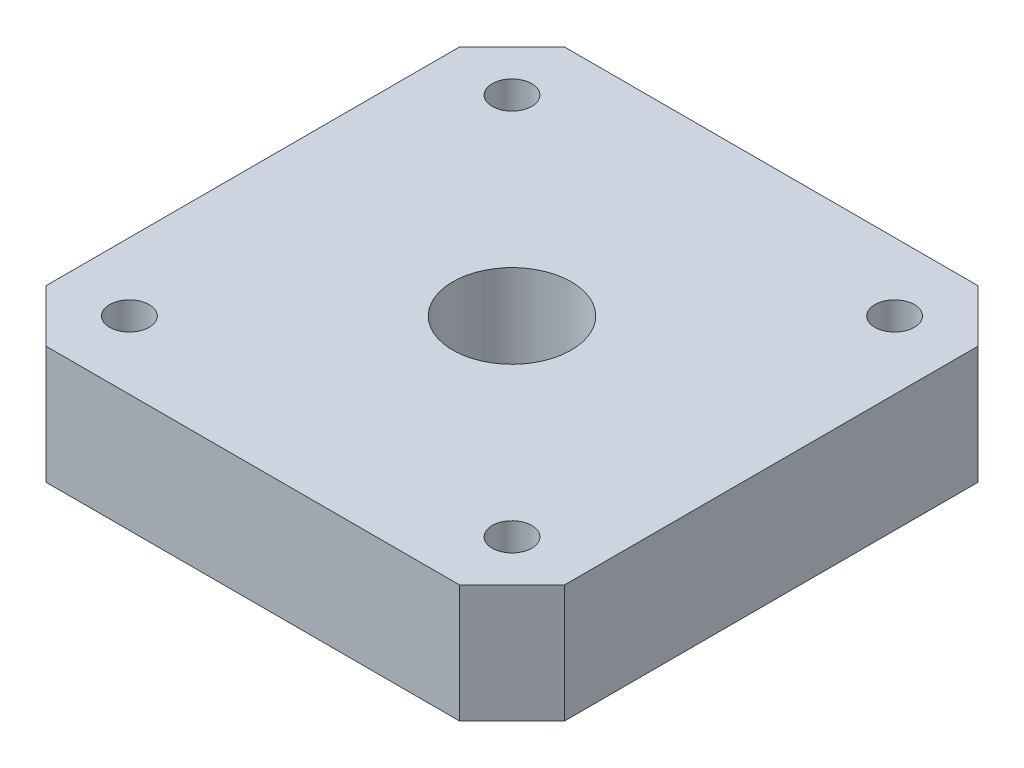
ISO-10303-21;
HEADER;
FILE_DESCRIPTION(('STEP AP214'),'2;1');
FILE_NAME('part.step','',(''),(''),'','','');
FILE_SCHEMA(('AUTOMOTIVE_DESIGN { 1 0 10303 214 1 1 1 1 }'));
ENDSEC;
DATA;
#1=APPLICATION_CONTEXT('core data for automotive mechanical design processes');
#2=APPLICATION_PROTOCOL_DEFINITION('international standard','automotive_design',2000,#1);
#3=PRODUCT_CONTEXT('',#1,'mechanical');
#4=PRODUCT('Part','Part','',(#3));
#5=PRODUCT_RELATED_PRODUCT_CATEGORY('part','',(#4));
#6=PRODUCT_DEFINITION_FORMATION('','',#4);
#7=PRODUCT_DEFINITION_CONTEXT('part definition',#1,'design');
#8=PRODUCT_DEFINITION('design','',#6,#7);
#9=PRODUCT_DEFINITION_SHAPE('','',#8);
#10=(LENGTH_UNIT() NAMED_UNIT(*) SI_UNIT(.MILLI.,.METRE.));
#11=(NAMED_UNIT(*) PLANE_ANGLE_UNIT() SI_UNIT($,.RADIAN.));
#12=(NAMED_UNIT(*) SI_UNIT($,.STERADIAN.) SOLID_ANGLE_UNIT());
#13=UNCERTAINTY_MEASURE_WITH_UNIT(LENGTH_MEASURE(1.E-05),#10,'distance_accuracy_value','');
#14=(GEOMETRIC_REPRESENTATION_CONTEXT(3) GLOBAL_UNCERTAINTY_ASSIGNED_CONTEXT((#13)) GLOBAL_UNIT_ASSIGNED_CONTEXT((#10,
#11,#12)) REPRESENTATION_CONTEXT('',''));
#15=CARTESIAN_POINT('',(0.,0.,0.));
#16=DIRECTION('',(0.,0.,1.));
#17=DIRECTION('',(1.,0.,0.));
#18=AXIS2_PLACEMENT_3D('',#15,#16,#17);
#19=CARTESIAN_POINT('',(21.,-9.55,21.));
#20=DIRECTION('',(1.,0.,0.));
#21=DIRECTION('',(0.,0.,-1.));
#22=AXIS2_PLACEMENT_3D('',#19,#20,#21);
#23=PLANE('',#22);
#24=DIRECTION('',(0.,-1.,0.));
#25=VECTOR('',#24,1.);
#26=CARTESIAN_POINT('',(20.9999999999963,0.,16.7573593128807));
#27=LINE('',#26,#25);
#28=CARTESIAN_POINT('',(21.,0.,16.7573593128807));
#29=VERTEX_POINT('',#28);
#30=CARTESIAN_POINT('',(20.9999999999963,-9.55,16.7573593128807));
#31=VERTEX_POINT('',#30);
#32=EDGE_CURVE('E163',#29,#31,#27,.T.);
#33=ORIENTED_EDGE('',*,*,#32,.T.);
#34=DIRECTION('',(0.,0.,-1.));
#35=VECTOR('',#34,1.);
#36=CARTESIAN_POINT('',(21.,-9.55,21.));
#37=LINE('',#36,#35);
#38=CARTESIAN_POINT('',(20.9999999999963,-9.55,-16.7573593128807));
#39=VERTEX_POINT('',#38);
#40=EDGE_CURVE('E135',#31,#39,#37,.T.);
#41=ORIENTED_EDGE('',*,*,#40,.T.);
#42=DIRECTION('',(0.,-1.,0.));
#43=VECTOR('',#42,1.);
#44=CARTESIAN_POINT('',(20.9999999999963,0.,-16.7573593128807));
#45=LINE('',#44,#43);
#46=CARTESIAN_POINT('',(20.9999999999963,0.,-16.7573593128807));
#47=VERTEX_POINT('',#46);
#48=EDGE_CURVE('E171',#47,#39,#45,.T.);
#49=ORIENTED_EDGE('',*,*,#48,.F.);
#50=DIRECTION('',(0.,0.,-1.));
#51=VECTOR('',#50,1.);
#52=CARTESIAN_POINT('',(21.,0.,21.));
#53=LINE('',#52,#51);
#54=EDGE_CURVE('E136',#29,#47,#53,.T.);
#55=ORIENTED_EDGE('',*,*,#54,.F.);
#56=EDGE_LOOP('',(#33,#41,#49,#55));
#57=FACE_BOUND('',#56,.T.);
#58=ADVANCED_FACE('F43',(#57),#23,.T.);
#59=CARTESIAN_POINT('',(-21.,-9.55,21.));
#60=DIRECTION('',(0.,0.,1.));
#61=DIRECTION('',(1.,0.,0.));
#62=AXIS2_PLACEMENT_3D('',#59,#60,#61);
#63=PLANE('',#62);
#64=DIRECTION('',(0.,-1.,0.));
#65=VECTOR('',#64,1.);
#66=CARTESIAN_POINT('',(16.757359312877,0.,21.));
#67=LINE('',#66,#65);
#68=CARTESIAN_POINT('',(16.757359312877,0.,21.));
#69=VERTEX_POINT('',#68);
#70=CARTESIAN_POINT('',(16.757359312877,-9.55,21.));
#71=VERTEX_POINT('',#70);
#72=EDGE_CURVE('E165',#69,#71,#67,.T.);
#73=ORIENTED_EDGE('',*,*,#72,.F.);
#74=DIRECTION('',(1.,0.,0.));
#75=VECTOR('',#74,1.);
#76=CARTESIAN_POINT('',(-21.,0.,21.));
#77=LINE('',#76,#75);
#78=CARTESIAN_POINT('',(-16.7573593128844,0.,21.));
#79=VERTEX_POINT('',#78);
#80=EDGE_CURVE('E46',#79,#69,#77,.T.);
#81=ORIENTED_EDGE('',*,*,#80,.F.);
#82=DIRECTION('',(0.,-1.,0.));
#83=VECTOR('',#82,1.);
#84=CARTESIAN_POINT('',(-16.7573593128845,0.,21.));
#85=LINE('',#84,#83);
#86=CARTESIAN_POINT('',(-16.7573593128845,-9.55,21.));
#87=VERTEX_POINT('',#86);
#88=EDGE_CURVE('E56',#79,#87,#85,.T.);
#89=ORIENTED_EDGE('',*,*,#88,.T.);
#90=DIRECTION('',(1.,0.,0.));
#91=VECTOR('',#90,1.);
#92=CARTESIAN_POINT('',(-21.,-9.55,21.));
#93=LINE('',#92,#91);
#94=EDGE_CURVE('E11',#87,#71,#93,.T.);
#95=ORIENTED_EDGE('',*,*,#94,.T.);
#96=EDGE_LOOP('',(#73,#81,#89,#95));
#97=FACE_BOUND('',#96,.T.);
#98=ADVANCED_FACE('F277',(#97),#63,.T.);
#99=CARTESIAN_POINT('',(-21.,-9.55,21.));
#100=DIRECTION('',(-1.,0.,0.));
#101=DIRECTION('',(0.,0.,1.));
#102=AXIS2_PLACEMENT_3D('',#99,#100,#101);
#103=PLANE('',#102);
#104=DIRECTION('',(0.,-1.,0.));
#105=VECTOR('',#104,1.);
#106=CARTESIAN_POINT('',(-21.0000000000037,0.,-16.7573593128807));
#107=LINE('',#106,#105);
#108=CARTESIAN_POINT('',(-21.,0.,-16.7573593128844));
#109=VERTEX_POINT('',#108);
#110=CARTESIAN_POINT('',(-21.0000000000037,-9.55,-16.7573593128807));
#111=VERTEX_POINT('',#110);
#112=EDGE_CURVE('E66',#109,#111,#107,.T.);
#113=ORIENTED_EDGE('',*,*,#112,.T.);
#114=DIRECTION('',(0.,0.,1.));
#115=VECTOR('',#114,1.);
#116=CARTESIAN_POINT('',(-21.,-9.55,21.));
#117=LINE('',#116,#115);
#118=CARTESIAN_POINT('',(-21.0000000000037,-9.55,16.7573593128807));
#119=VERTEX_POINT('',#118);
#120=EDGE_CURVE('E51',#111,#119,#117,.T.);
#121=ORIENTED_EDGE('',*,*,#120,.T.);
#122=DIRECTION('',(0.,-1.,0.));
#123=VECTOR('',#122,1.);
#124=CARTESIAN_POINT('',(-21.0000000000037,0.,16.7573593128807));
#125=LINE('',#124,#123);
#126=CARTESIAN_POINT('',(-21.0000000000037,0.,16.7573593128807));
#127=VERTEX_POINT('',#126);
#128=EDGE_CURVE('E151',#127,#119,#125,.T.);
#129=ORIENTED_EDGE('',*,*,#128,.F.);
#130=DIRECTION('',(0.,0.,1.));
#131=VECTOR('',#130,1.);
#132=CARTESIAN_POINT('',(-21.,0.,21.));
#133=LINE('',#132,#131);
#134=EDGE_CURVE('E121',#109,#127,#133,.T.);
#135=ORIENTED_EDGE('',*,*,#134,.F.);
#136=EDGE_LOOP('',(#113,#121,#129,#135));
#137=FACE_BOUND('',#136,.T.);
#138=ADVANCED_FACE('F122',(#137),#103,.T.);
#139=CARTESIAN_POINT('',(-21.,-9.55,-21.));
#140=DIRECTION('',(0.,0.,-1.));
#141=DIRECTION('',(-1.,0.,0.));
#142=AXIS2_PLACEMENT_3D('',#139,#140,#141);
#143=PLANE('',#142);
#144=DIRECTION('',(0.,-1.,0.));
#145=VECTOR('',#144,1.);
#146=CARTESIAN_POINT('',(16.757359312877,0.,-21.));
#147=LINE('',#146,#145);
#148=CARTESIAN_POINT('',(16.757359312877,0.,-21.));
#149=VERTEX_POINT('',#148);
#150=CARTESIAN_POINT('',(16.757359312877,-9.55,-21.));
#151=VERTEX_POINT('',#150);
#152=EDGE_CURVE('E161',#149,#151,#147,.T.);
#153=ORIENTED_EDGE('',*,*,#152,.T.);
#154=DIRECTION('',(-1.,0.,0.));
#155=VECTOR('',#154,1.);
#156=CARTESIAN_POINT('',(-21.,-9.55,-21.));
#157=LINE('',#156,#155);
#158=CARTESIAN_POINT('',(-16.7573593128845,-9.55,-21.));
#159=VERTEX_POINT('',#158);
#160=EDGE_CURVE('E134',#151,#159,#157,.T.);
#161=ORIENTED_EDGE('',*,*,#160,.T.);
#162=DIRECTION('',(0.,-1.,0.));
#163=VECTOR('',#162,1.);
#164=CARTESIAN_POINT('',(-16.7573593128845,0.,-21.));
#165=LINE('',#164,#163);
#166=CARTESIAN_POINT('',(-16.7573593128845,0.,-21.));
#167=VERTEX_POINT('',#166);
#168=EDGE_CURVE('E109',#167,#159,#165,.T.);
#169=ORIENTED_EDGE('',*,*,#168,.F.);
#170=DIRECTION('',(-1.,0.,0.));
#171=VECTOR('',#170,1.);
#172=CARTESIAN_POINT('',(-21.,0.,-21.));
#173=LINE('',#172,#171);
#174=EDGE_CURVE('E137',#149,#167,#173,.T.);
#175=ORIENTED_EDGE('',*,*,#174,.F.);
#176=EDGE_LOOP('',(#153,#161,#169,#175));
#177=FACE_BOUND('',#176,.T.);
#178=ADVANCED_FACE('F252',(#177),#143,.T.);
#179=CARTESIAN_POINT('',(0.,-9.55,0.));
#180=DIRECTION('',(0.,-1.,0.));
#181=DIRECTION('',(0.,0.,-1.));
#182=AXIS2_PLACEMENT_3D('',#179,#180,#181);
#183=PLANE('',#182);
#184=CARTESIAN_POINT('',(15.4999999999963,-9.55,-15.4999999999999));
#185=DIRECTION('',(0.,-1.,0.));
#186=DIRECTION('',(0.,0.,-1.));
#187=AXIS2_PLACEMENT_3D('',#184,#185,#186);
#188=CIRCLE('',#187,2.00000000000352);
#189=CARTESIAN_POINT('',(15.4999999999963,-9.55,-17.5000000000035));
#190=VERTEX_POINT('',#189);
#191=EDGE_CURVE('E194',#190,#190,#188,.T.);
#192=ORIENTED_EDGE('',*,*,#191,.F.);
#193=EDGE_LOOP('',(#192));
#194=FACE_BOUND('',#193,.T.);
#195=CARTESIAN_POINT('',(15.4999999999963,-9.55,15.5000000000001));
#196=DIRECTION('',(0.,-1.,0.));
#197=DIRECTION('',(0.,0.,-1.));
#198=AXIS2_PLACEMENT_3D('',#195,#196,#197);
#199=CIRCLE('',#198,2.00000000000352);
#200=CARTESIAN_POINT('',(15.4999999999963,-9.55,13.4999999999965));
#201=VERTEX_POINT('',#200);
#202=EDGE_CURVE('E197',#201,#201,#199,.T.);
#203=ORIENTED_EDGE('',*,*,#202,.F.);
#204=EDGE_LOOP('',(#203));
#205=FACE_BOUND('',#204,.T.);
#206=CARTESIAN_POINT('',(-15.5000000000037,-9.55,15.5000000000001));
#207=DIRECTION('',(0.,-1.,0.));
#208=DIRECTION('',(0.,0.,-1.));
#209=AXIS2_PLACEMENT_3D('',#206,#207,#208);
#210=CIRCLE('',#209,2.00000000000352);
#211=CARTESIAN_POINT('',(-15.5000000000037,-9.55,13.4999999999965));
#212=VERTEX_POINT('',#211);
#213=EDGE_CURVE('E190',#212,#212,#210,.T.);
#214=ORIENTED_EDGE('',*,*,#213,.F.);
#215=EDGE_LOOP('',(#214));
#216=FACE_BOUND('',#215,.T.);
#217=CARTESIAN_POINT('',(-15.5000000000037,-9.55,-15.4999999999999));
#218=DIRECTION('',(0.,-1.,0.));
#219=DIRECTION('',(0.,0.,-1.));
#220=AXIS2_PLACEMENT_3D('',#217,#218,#219);
#221=CIRCLE('',#220,2.00000000000352);
#222=CARTESIAN_POINT('',(-15.5000000000037,-9.55,-17.5000000000035));
#223=VERTEX_POINT('',#222);
#224=EDGE_CURVE('E183',#223,#223,#221,.T.);
#225=ORIENTED_EDGE('',*,*,#224,.F.);
#226=EDGE_LOOP('',(#225));
#227=FACE_BOUND('',#226,.T.);
#228=CARTESIAN_POINT('',(-3.74049749507499E-12,-9.55,0.));
#229=DIRECTION('',(0.,-1.,0.));
#230=DIRECTION('',(0.,0.,-1.));
#231=AXIS2_PLACEMENT_3D('',#228,#229,#230);
#232=CIRCLE('',#231,4.80000000000353);
#233=CARTESIAN_POINT('',(-3.74049749507499E-12,-9.55,-4.80000000000353));
#234=VERTEX_POINT('',#233);
#235=EDGE_CURVE('E178',#234,#234,#232,.T.);
#236=ORIENTED_EDGE('',*,*,#235,.F.);
#237=EDGE_LOOP('',(#236));
#238=FACE_BOUND('',#237,.T.);
#239=DIRECTION('',(0.707106781186547,0.,-0.707106781186547));
#240=VECTOR('',#239,1.);
#241=CARTESIAN_POINT('',(16.757359312877,-9.55,21.));
#242=LINE('',#241,#240);
#243=EDGE_CURVE('E159',#71,#31,#242,.T.);
#244=ORIENTED_EDGE('',*,*,#243,.F.);
#245=ORIENTED_EDGE('',*,*,#94,.F.);
#246=DIRECTION('',(0.707106781186547,0.,0.707106781186548));
#247=VECTOR('',#246,1.);
#248=CARTESIAN_POINT('',(-21.0000000000037,-9.55,16.7573593128807));
#249=LINE('',#248,#247);
#250=EDGE_CURVE('E114',#119,#87,#249,.T.);
#251=ORIENTED_EDGE('',*,*,#250,.F.);
#252=ORIENTED_EDGE('',*,*,#120,.F.);
#253=DIRECTION('',(-0.707106781186547,0.,0.707106781186547));
#254=VECTOR('',#253,1.);
#255=CARTESIAN_POINT('',(-21.0000000000037,-9.55,-16.7573593128807));
#256=LINE('',#255,#254);
#257=EDGE_CURVE('E110',#159,#111,#256,.T.);
#258=ORIENTED_EDGE('',*,*,#257,.F.);
#259=ORIENTED_EDGE('',*,*,#160,.F.);
#260=DIRECTION('',(-0.707106781186548,0.,-0.707106781186547));
#261=VECTOR('',#260,1.);
#262=CARTESIAN_POINT('',(20.9999999999963,-9.55,-16.7573593128807));
#263=LINE('',#262,#261);
#264=EDGE_CURVE('E123',#39,#151,#263,.T.);
#265=ORIENTED_EDGE('',*,*,#264,.F.);
#266=ORIENTED_EDGE('',*,*,#40,.F.);
#267=EDGE_LOOP('',(#244,#245,#251,#252,#258,#259,#265,#266));
#268=FACE_BOUND('',#267,.T.);
#269=ADVANCED_FACE('F126',(#194,#205,#216,#227,#238,#268),#183,.T.);
#270=CARTESIAN_POINT('',(0.,0.,0.));
#271=DIRECTION('',(0.,-1.,0.));
#272=DIRECTION('',(0.,0.,-1.));
#273=AXIS2_PLACEMENT_3D('',#270,#271,#272);
#274=PLANE('',#273);
#275=CARTESIAN_POINT('',(-15.5,0.,-15.4999999999998));
#276=DIRECTION('',(0.,-1.,0.));
#277=DIRECTION('',(0.,0.,-1.));
#278=AXIS2_PLACEMENT_3D('',#275,#276,#277);
#279=CIRCLE('',#278,1.6);
#280=CARTESIAN_POINT('',(-15.5,0.,-17.0999999999998));
#281=VERTEX_POINT('',#280);
#282=EDGE_CURVE('E221',#281,#281,#279,.T.);
#283=ORIENTED_EDGE('',*,*,#282,.T.);
#284=EDGE_LOOP('',(#283));
#285=FACE_BOUND('',#284,.T.);
#286=CARTESIAN_POINT('',(15.5,0.,15.5000000000002));
#287=DIRECTION('',(0.,-1.,0.));
#288=DIRECTION('',(0.,0.,-1.));
#289=AXIS2_PLACEMENT_3D('',#286,#287,#288);
#290=CIRCLE('',#289,1.6);
#291=CARTESIAN_POINT('',(15.5,0.,13.9000000000002));
#292=VERTEX_POINT('',#291);
#293=EDGE_CURVE('E211',#292,#292,#290,.T.);
#294=ORIENTED_EDGE('',*,*,#293,.T.);
#295=EDGE_LOOP('',(#294));
#296=FACE_BOUND('',#295,.T.);
#297=CARTESIAN_POINT('',(-15.5,0.,15.5000000000002));
#298=DIRECTION('',(0.,-1.,0.));
#299=DIRECTION('',(0.,0.,-1.));
#300=AXIS2_PLACEMENT_3D('',#297,#298,#299);
#301=CIRCLE('',#300,1.6);
#302=CARTESIAN_POINT('',(-15.5,0.,13.9000000000002));
#303=VERTEX_POINT('',#302);
#304=EDGE_CURVE('E228',#303,#303,#301,.T.);
#305=ORIENTED_EDGE('',*,*,#304,.T.);
#306=EDGE_LOOP('',(#305));
#307=FACE_BOUND('',#306,.T.);
#308=CARTESIAN_POINT('',(15.5,0.,-15.4999999999998));
#309=DIRECTION('',(0.,-1.,0.));
#310=DIRECTION('',(0.,0.,-1.));
#311=AXIS2_PLACEMENT_3D('',#308,#309,#310);
#312=CIRCLE('',#311,1.6);
#313=CARTESIAN_POINT('',(15.5,0.,-17.0999999999998));
#314=VERTEX_POINT('',#313);
#315=EDGE_CURVE('E191',#314,#314,#312,.T.);
#316=ORIENTED_EDGE('',*,*,#315,.T.);
#317=EDGE_LOOP('',(#316));
#318=FACE_BOUND('',#317,.T.);
#319=CARTESIAN_POINT('',(-3.74049749507499E-12,0.,0.));
#320=DIRECTION('',(0.,-1.,0.));
#321=DIRECTION('',(0.,0.,-1.));
#322=AXIS2_PLACEMENT_3D('',#319,#320,#321);
#323=CIRCLE('',#322,4.80000000000353);
#324=CARTESIAN_POINT('',(-3.74049749507499E-12,0.,-4.80000000000353));
#325=VERTEX_POINT('',#324);
#326=EDGE_CURVE('E168',#325,#325,#323,.T.);
#327=ORIENTED_EDGE('',*,*,#326,.T.);
#328=EDGE_LOOP('',(#327));
#329=FACE_BOUND('',#328,.T.);
#330=ORIENTED_EDGE('',*,*,#80,.T.);
#331=DIRECTION('',(0.707106781186547,0.,-0.707106781186547));
#332=VECTOR('',#331,1.);
#333=CARTESIAN_POINT('',(16.757359312877,0.,21.));
#334=LINE('',#333,#332);
#335=EDGE_CURVE('E158',#69,#29,#334,.T.);
#336=ORIENTED_EDGE('',*,*,#335,.T.);
#337=ORIENTED_EDGE('',*,*,#54,.T.);
#338=DIRECTION('',(-0.707106781186548,0.,-0.707106781186547));
#339=VECTOR('',#338,1.);
#340=CARTESIAN_POINT('',(20.9999999999963,0.,-16.7573593128807));
#341=LINE('',#340,#339);
#342=EDGE_CURVE('E166',#47,#149,#341,.T.);
#343=ORIENTED_EDGE('',*,*,#342,.T.);
#344=ORIENTED_EDGE('',*,*,#174,.T.);
#345=DIRECTION('',(-0.707106781186547,0.,0.707106781186547));
#346=VECTOR('',#345,1.);
#347=CARTESIAN_POINT('',(-21.0000000000037,0.,-16.7573593128807));
#348=LINE('',#347,#346);
#349=EDGE_CURVE('E116',#167,#109,#348,.T.);
#350=ORIENTED_EDGE('',*,*,#349,.T.);
#351=ORIENTED_EDGE('',*,*,#134,.T.);
#352=DIRECTION('',(0.707106781186547,0.,0.707106781186548));
#353=VECTOR('',#352,1.);
#354=CARTESIAN_POINT('',(-21.0000000000037,0.,16.7573593128807));
#355=LINE('',#354,#353);
#356=EDGE_CURVE('E153',#127,#79,#355,.T.);
#357=ORIENTED_EDGE('',*,*,#356,.T.);
#358=EDGE_LOOP('',(#330,#336,#337,#343,#344,#350,#351,#357));
#359=FACE_BOUND('',#358,.T.);
#360=ADVANCED_FACE('F249',(#285,#296,#307,#318,#329,#359),#274,.F.);
#361=CARTESIAN_POINT('',(-21.0000000000037,0.,16.7573593128807));
#362=DIRECTION('',(0.707106781186548,0.,-0.707106781186547));
#363=DIRECTION('',(-0.707106781186547,0.,-0.707106781186548));
#364=AXIS2_PLACEMENT_3D('',#361,#362,#363);
#365=PLANE('',#364);
#366=ORIENTED_EDGE('',*,*,#250,.T.);
#367=ORIENTED_EDGE('',*,*,#88,.F.);
#368=ORIENTED_EDGE('',*,*,#356,.F.);
#369=ORIENTED_EDGE('',*,*,#128,.T.);
#370=EDGE_LOOP('',(#366,#367,#368,#369));
#371=FACE_BOUND('',#370,.T.);
#372=ADVANCED_FACE('F287',(#371),#365,.F.);
#373=CARTESIAN_POINT('',(-21.0000000000037,0.,-16.7573593128807));
#374=DIRECTION('',(0.707106781186547,0.,0.707106781186547));
#375=DIRECTION('',(0.707106781186548,0.,-0.707106781186548));
#376=AXIS2_PLACEMENT_3D('',#373,#374,#375);
#377=PLANE('',#376);
#378=ORIENTED_EDGE('',*,*,#257,.T.);
#379=ORIENTED_EDGE('',*,*,#112,.F.);
#380=ORIENTED_EDGE('',*,*,#349,.F.);
#381=ORIENTED_EDGE('',*,*,#168,.T.);
#382=EDGE_LOOP('',(#378,#379,#380,#381));
#383=FACE_BOUND('',#382,.T.);
#384=ADVANCED_FACE('F108',(#383),#377,.F.);
#385=CARTESIAN_POINT('',(20.9999999999963,0.,-16.7573593128807));
#386=DIRECTION('',(-0.707106781186547,0.,0.707106781186548));
#387=DIRECTION('',(0.707106781186548,0.,0.707106781186547));
#388=AXIS2_PLACEMENT_3D('',#385,#386,#387);
#389=PLANE('',#388);
#390=ORIENTED_EDGE('',*,*,#264,.T.);
#391=ORIENTED_EDGE('',*,*,#152,.F.);
#392=ORIENTED_EDGE('',*,*,#342,.F.);
#393=ORIENTED_EDGE('',*,*,#48,.T.);
#394=EDGE_LOOP('',(#390,#391,#392,#393));
#395=FACE_BOUND('',#394,.T.);
#396=ADVANCED_FACE('F267',(#395),#389,.F.);
#397=CARTESIAN_POINT('',(16.757359312877,0.,21.));
#398=DIRECTION('',(-0.707106781186547,0.,-0.707106781186547));
#399=DIRECTION('',(-0.707106781186548,0.,0.707106781186548));
#400=AXIS2_PLACEMENT_3D('',#397,#398,#399);
#401=PLANE('',#400);
#402=ORIENTED_EDGE('',*,*,#243,.T.);
#403=ORIENTED_EDGE('',*,*,#32,.F.);
#404=ORIENTED_EDGE('',*,*,#335,.F.);
#405=ORIENTED_EDGE('',*,*,#72,.T.);
#406=EDGE_LOOP('',(#402,#403,#404,#405));
#407=FACE_BOUND('',#406,.T.);
#408=ADVANCED_FACE('F264',(#407),#401,.F.);
#409=CARTESIAN_POINT('',(-3.74049749507499E-12,0.,0.));
#410=DIRECTION('',(0.,-1.,0.));
#411=DIRECTION('',(0.,0.,-1.));
#412=AXIS2_PLACEMENT_3D('',#409,#410,#411);
#413=CYLINDRICAL_SURFACE('',#412,4.80000000000353);
#414=ORIENTED_EDGE('',*,*,#326,.F.);
#415=EDGE_LOOP('',(#414));
#416=FACE_BOUND('',#415,.T.);
#417=ORIENTED_EDGE('',*,*,#235,.T.);
#418=EDGE_LOOP('',(#417));
#419=FACE_BOUND('',#418,.T.);
#420=ADVANCED_FACE('F259',(#416,#419),#413,.F.);
#421=CARTESIAN_POINT('',(-15.5000000000037,-6.55,-15.4999999999999));
#422=DIRECTION('',(0.,-1.,0.));
#423=DIRECTION('',(0.,0.,-1.));
#424=AXIS2_PLACEMENT_3D('',#421,#422,#423);
#425=CYLINDRICAL_SURFACE('',#424,2.00000000000352);
#426=CARTESIAN_POINT('',(-15.5000000000037,-6.55,-15.4999999999999));
#427=DIRECTION('',(0.,-1.,0.));
#428=DIRECTION('',(0.,0.,-1.));
#429=AXIS2_PLACEMENT_3D('',#426,#427,#428);
#430=CIRCLE('',#429,2.00000000000352);
#431=CARTESIAN_POINT('',(-15.5000000000037,-6.55,-17.5000000000035));
#432=VERTEX_POINT('',#431);
#433=EDGE_CURVE('E181',#432,#432,#430,.T.);
#434=ORIENTED_EDGE('',*,*,#433,.F.);
#435=EDGE_LOOP('',(#434));
#436=FACE_BOUND('',#435,.T.);
#437=ORIENTED_EDGE('',*,*,#224,.T.);
#438=EDGE_LOOP('',(#437));
#439=FACE_BOUND('',#438,.T.);
#440=ADVANCED_FACE('F258',(#436,#439),#425,.F.);
#441=CARTESIAN_POINT('',(-15.5000000000037,-6.55,-15.4999999999999));
#442=DIRECTION('',(0.,-1.,0.));
#443=DIRECTION('',(0.,0.,-1.));
#444=AXIS2_PLACEMENT_3D('',#441,#442,#443);
#445=PLANE('',#444);
#446=CARTESIAN_POINT('',(-15.5,-6.55,-15.4999999999998));
#447=DIRECTION('',(0.,-1.,0.));
#448=DIRECTION('',(0.,0.,-1.));
#449=AXIS2_PLACEMENT_3D('',#446,#447,#448);
#450=CIRCLE('',#449,1.6);
#451=CARTESIAN_POINT('',(-15.5,-6.55,-17.0999999999998));
#452=VERTEX_POINT('',#451);
#453=EDGE_CURVE('E212',#452,#452,#450,.T.);
#454=ORIENTED_EDGE('',*,*,#453,.F.);
#455=EDGE_LOOP('',(#454));
#456=FACE_BOUND('',#455,.T.);
#457=ORIENTED_EDGE('',*,*,#433,.T.);
#458=EDGE_LOOP('',(#457));
#459=FACE_BOUND('',#458,.T.);
#460=ADVANCED_FACE('F242',(#456,#459),#445,.T.);
#461=CARTESIAN_POINT('',(-15.5000000000037,-6.55,15.5000000000001));
#462=DIRECTION('',(0.,-1.,0.));
#463=DIRECTION('',(0.,0.,-1.));
#464=AXIS2_PLACEMENT_3D('',#461,#462,#463);
#465=CYLINDRICAL_SURFACE('',#464,2.00000000000352);
#466=CARTESIAN_POINT('',(-15.5000000000037,-6.55,15.5000000000001));
#467=DIRECTION('',(0.,-1.,0.));
#468=DIRECTION('',(0.,0.,-1.));
#469=AXIS2_PLACEMENT_3D('',#466,#467,#468);
#470=CIRCLE('',#469,2.00000000000352);
#471=CARTESIAN_POINT('',(-15.5000000000037,-6.55,13.4999999999965));
#472=VERTEX_POINT('',#471);
#473=EDGE_CURVE('E205',#472,#472,#470,.T.);
#474=ORIENTED_EDGE('',*,*,#473,.F.);
#475=EDGE_LOOP('',(#474));
#476=FACE_BOUND('',#475,.T.);
#477=ORIENTED_EDGE('',*,*,#213,.T.);
#478=EDGE_LOOP('',(#477));
#479=FACE_BOUND('',#478,.T.);
#480=ADVANCED_FACE('F238',(#476,#479),#465,.F.);
#481=CARTESIAN_POINT('',(-15.5000000000037,-6.55,15.5000000000001));
#482=DIRECTION('',(0.,-1.,0.));
#483=DIRECTION('',(0.,0.,-1.));
#484=AXIS2_PLACEMENT_3D('',#481,#482,#483);
#485=PLANE('',#484);
#486=CARTESIAN_POINT('',(-15.5,-6.55,15.5000000000002));
#487=DIRECTION('',(0.,-1.,0.));
#488=DIRECTION('',(0.,0.,-1.));
#489=AXIS2_PLACEMENT_3D('',#486,#487,#488);
#490=CIRCLE('',#489,1.6);
#491=CARTESIAN_POINT('',(-15.5,-6.55,13.9000000000002));
#492=VERTEX_POINT('',#491);
#493=EDGE_CURVE('E220',#492,#492,#490,.T.);
#494=ORIENTED_EDGE('',*,*,#493,.F.);
#495=EDGE_LOOP('',(#494));
#496=FACE_BOUND('',#495,.T.);
#497=ORIENTED_EDGE('',*,*,#473,.T.);
#498=EDGE_LOOP('',(#497));
#499=FACE_BOUND('',#498,.T.);
#500=ADVANCED_FACE('F234',(#496,#499),#485,.T.);
#501=CARTESIAN_POINT('',(15.4999999999963,-6.55,15.5000000000001));
#502=DIRECTION('',(0.,-1.,0.));
#503=DIRECTION('',(0.,0.,-1.));
#504=AXIS2_PLACEMENT_3D('',#501,#502,#503);
#505=CYLINDRICAL_SURFACE('',#504,2.00000000000352);
#506=CARTESIAN_POINT('',(15.4999999999963,-6.55,15.5000000000001));
#507=DIRECTION('',(0.,-1.,0.));
#508=DIRECTION('',(0.,0.,-1.));
#509=AXIS2_PLACEMENT_3D('',#506,#507,#508);
#510=CIRCLE('',#509,2.00000000000352);
#511=CARTESIAN_POINT('',(15.4999999999963,-6.55,13.4999999999965));
#512=VERTEX_POINT('',#511);
#513=EDGE_CURVE('E196',#512,#512,#510,.T.);
#514=ORIENTED_EDGE('',*,*,#513,.F.);
#515=EDGE_LOOP('',(#514));
#516=FACE_BOUND('',#515,.T.);
#517=ORIENTED_EDGE('',*,*,#202,.T.);
#518=EDGE_LOOP('',(#517));
#519=FACE_BOUND('',#518,.T.);
#520=ADVANCED_FACE('F240',(#516,#519),#505,.F.);
#521=CARTESIAN_POINT('',(15.4999999999963,-6.55,15.5000000000001));
#522=DIRECTION('',(0.,-1.,0.));
#523=DIRECTION('',(0.,0.,-1.));
#524=AXIS2_PLACEMENT_3D('',#521,#522,#523);
#525=PLANE('',#524);
#526=CARTESIAN_POINT('',(15.5,-6.55,15.5000000000002));
#527=DIRECTION('',(0.,-1.,0.));
#528=DIRECTION('',(0.,0.,-1.));
#529=AXIS2_PLACEMENT_3D('',#526,#527,#528);
#530=CIRCLE('',#529,1.6);
#531=CARTESIAN_POINT('',(15.5,-6.55,13.9000000000002));
#532=VERTEX_POINT('',#531);
#533=EDGE_CURVE('E216',#532,#532,#530,.T.);
#534=ORIENTED_EDGE('',*,*,#533,.F.);
#535=EDGE_LOOP('',(#534));
#536=FACE_BOUND('',#535,.T.);
#537=ORIENTED_EDGE('',*,*,#513,.T.);
#538=EDGE_LOOP('',(#537));
#539=FACE_BOUND('',#538,.T.);
#540=ADVANCED_FACE('F374',(#536,#539),#525,.T.);
#541=CARTESIAN_POINT('',(15.4999999999963,-6.55,-15.4999999999999));
#542=DIRECTION('',(0.,-1.,0.));
#543=DIRECTION('',(0.,0.,-1.));
#544=AXIS2_PLACEMENT_3D('',#541,#542,#543);
#545=CYLINDRICAL_SURFACE('',#544,2.00000000000352);
#546=CARTESIAN_POINT('',(15.4999999999963,-6.55,-15.4999999999999));
#547=DIRECTION('',(0.,-1.,0.));
#548=DIRECTION('',(0.,0.,-1.));
#549=AXIS2_PLACEMENT_3D('',#546,#547,#548);
#550=CIRCLE('',#549,2.00000000000352);
#551=CARTESIAN_POINT('',(15.4999999999963,-6.55,-17.5000000000035));
#552=VERTEX_POINT('',#551);
#553=EDGE_CURVE('E188',#552,#552,#550,.T.);
#554=ORIENTED_EDGE('',*,*,#553,.F.);
#555=EDGE_LOOP('',(#554));
#556=FACE_BOUND('',#555,.T.);
#557=ORIENTED_EDGE('',*,*,#191,.T.);
#558=EDGE_LOOP('',(#557));
#559=FACE_BOUND('',#558,.T.);
#560=ADVANCED_FACE('F383',(#556,#559),#545,.F.);
#561=CARTESIAN_POINT('',(15.4999999999963,-6.55,-15.4999999999999));
#562=DIRECTION('',(0.,-1.,0.));
#563=DIRECTION('',(0.,0.,-1.));
#564=AXIS2_PLACEMENT_3D('',#561,#562,#563);
#565=PLANE('',#564);
#566=CARTESIAN_POINT('',(15.5,-6.55,-15.4999999999998));
#567=DIRECTION('',(0.,-1.,0.));
#568=DIRECTION('',(0.,0.,-1.));
#569=AXIS2_PLACEMENT_3D('',#566,#567,#568);
#570=CIRCLE('',#569,1.6);
#571=CARTESIAN_POINT('',(15.5,-6.55,-17.0999999999998));
#572=VERTEX_POINT('',#571);
#573=EDGE_CURVE('E206',#572,#572,#570,.T.);
#574=ORIENTED_EDGE('',*,*,#573,.F.);
#575=EDGE_LOOP('',(#574));
#576=FACE_BOUND('',#575,.T.);
#577=ORIENTED_EDGE('',*,*,#553,.T.);
#578=EDGE_LOOP('',(#577));
#579=FACE_BOUND('',#578,.T.);
#580=ADVANCED_FACE('F392',(#576,#579),#565,.T.);
#581=CARTESIAN_POINT('',(15.5,0.,-15.4999999999998));
#582=DIRECTION('',(0.,-1.,0.));
#583=DIRECTION('',(0.,0.,-1.));
#584=AXIS2_PLACEMENT_3D('',#581,#582,#583);
#585=CYLINDRICAL_SURFACE('',#584,1.6);
#586=ORIENTED_EDGE('',*,*,#315,.F.);
#587=EDGE_LOOP('',(#586));
#588=FACE_BOUND('',#587,.T.);
#589=ORIENTED_EDGE('',*,*,#573,.T.);
#590=EDGE_LOOP('',(#589));
#591=FACE_BOUND('',#590,.T.);
#592=ADVANCED_FACE('F403',(#588,#591),#585,.F.);
#593=CARTESIAN_POINT('',(-15.5,0.,15.5000000000002));
#594=DIRECTION('',(0.,-1.,0.));
#595=DIRECTION('',(0.,0.,-1.));
#596=AXIS2_PLACEMENT_3D('',#593,#594,#595);
#597=CYLINDRICAL_SURFACE('',#596,1.6);
#598=ORIENTED_EDGE('',*,*,#304,.F.);
#599=EDGE_LOOP('',(#598));
#600=FACE_BOUND('',#599,.T.);
#601=ORIENTED_EDGE('',*,*,#493,.T.);
#602=EDGE_LOOP('',(#601));
#603=FACE_BOUND('',#602,.T.);
#604=ADVANCED_FACE('F235',(#600,#603),#597,.F.);
#605=CARTESIAN_POINT('',(15.5,0.,15.5000000000002));
#606=DIRECTION('',(0.,-1.,0.));
#607=DIRECTION('',(0.,0.,-1.));
#608=AXIS2_PLACEMENT_3D('',#605,#606,#607);
#609=CYLINDRICAL_SURFACE('',#608,1.6);
#610=ORIENTED_EDGE('',*,*,#293,.F.);
#611=EDGE_LOOP('',(#610));
#612=FACE_BOUND('',#611,.T.);
#613=ORIENTED_EDGE('',*,*,#533,.T.);
#614=EDGE_LOOP('',(#613));
#615=FACE_BOUND('',#614,.T.);
#616=ADVANCED_FACE('F424',(#612,#615),#609,.F.);
#617=CARTESIAN_POINT('',(-15.5,0.,-15.4999999999998));
#618=DIRECTION('',(0.,-1.,0.));
#619=DIRECTION('',(0.,0.,-1.));
#620=AXIS2_PLACEMENT_3D('',#617,#618,#619);
#621=CYLINDRICAL_SURFACE('',#620,1.6);
#622=ORIENTED_EDGE('',*,*,#282,.F.);
#623=EDGE_LOOP('',(#622));
#624=FACE_BOUND('',#623,.T.);
#625=ORIENTED_EDGE('',*,*,#453,.T.);
#626=EDGE_LOOP('',(#625));
#627=FACE_BOUND('',#626,.T.);
#628=ADVANCED_FACE('F436',(#624,#627),#621,.F.);
#629=CLOSED_SHELL('',(#58,#98,#138,#178,#269,#360,#372,#384,#396,#408,#420,#440,#460,#480,#500,
#520,#540,#560,#580,#592,#604,#616,#628));
#630=MANIFOLD_SOLID_BREP('B2',#629);
#631=ADVANCED_BREP_SHAPE_REPRESENTATION('',(#18,#630),#14);
#632=SHAPE_DEFINITION_REPRESENTATION(#9,#631);
ENDSEC;
END-ISO-10303-21;
